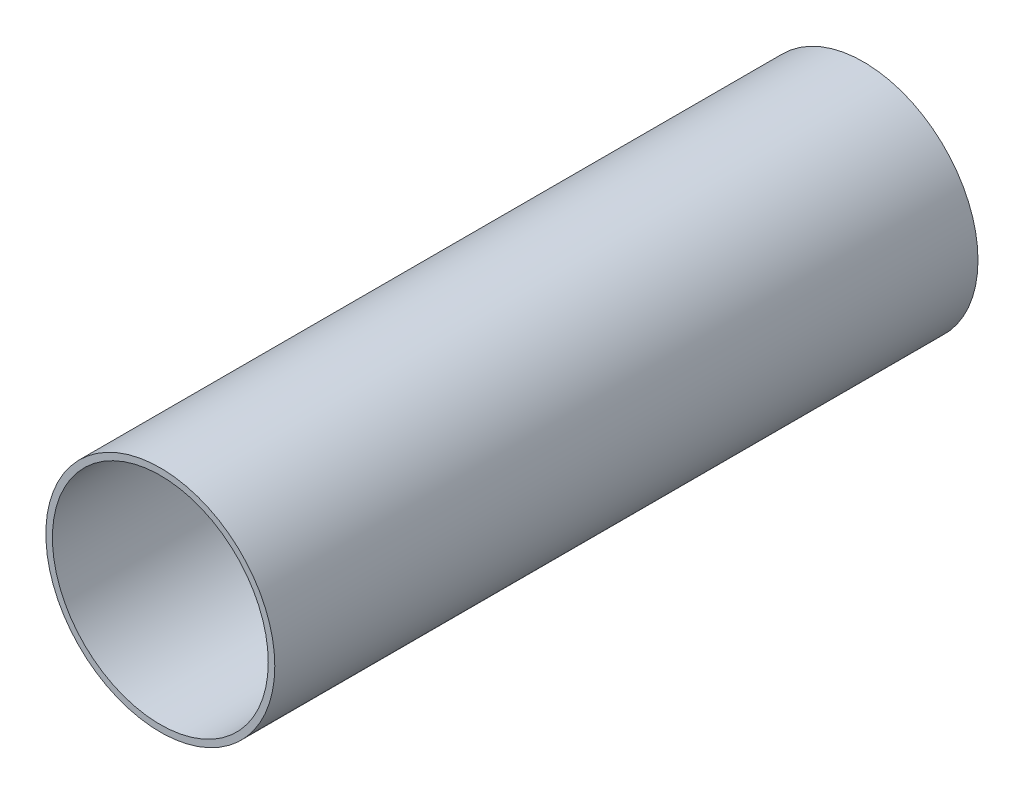
ISO-10303-21;
HEADER;
FILE_DESCRIPTION(('STEP AP214'),'2;1');
FILE_NAME('part.step','',(''),(''),'','','');
FILE_SCHEMA(('AUTOMOTIVE_DESIGN { 1 0 10303 214 1 1 1 1 }'));
ENDSEC;
DATA;
#1=APPLICATION_CONTEXT('core data for automotive mechanical design processes');
#2=APPLICATION_PROTOCOL_DEFINITION('international standard','automotive_design',2000,#1);
#3=PRODUCT_CONTEXT('',#1,'mechanical');
#4=PRODUCT('Part','Part','',(#3));
#5=PRODUCT_RELATED_PRODUCT_CATEGORY('part','',(#4));
#6=PRODUCT_DEFINITION_FORMATION('','',#4);
#7=PRODUCT_DEFINITION_CONTEXT('part definition',#1,'design');
#8=PRODUCT_DEFINITION('design','',#6,#7);
#9=PRODUCT_DEFINITION_SHAPE('','',#8);
#10=(LENGTH_UNIT() NAMED_UNIT(*) SI_UNIT(.MILLI.,.METRE.));
#11=(NAMED_UNIT(*) PLANE_ANGLE_UNIT() SI_UNIT($,.RADIAN.));
#12=(NAMED_UNIT(*) SI_UNIT($,.STERADIAN.) SOLID_ANGLE_UNIT());
#13=UNCERTAINTY_MEASURE_WITH_UNIT(LENGTH_MEASURE(1.E-05),#10,'distance_accuracy_value','');
#14=(GEOMETRIC_REPRESENTATION_CONTEXT(3) GLOBAL_UNCERTAINTY_ASSIGNED_CONTEXT((#13)) GLOBAL_UNIT_ASSIGNED_CONTEXT((#10,
#11,#12)) REPRESENTATION_CONTEXT('',''));
#15=CARTESIAN_POINT('',(0.,0.,0.));
#16=DIRECTION('',(0.,0.,1.));
#17=DIRECTION('',(1.,0.,0.));
#18=AXIS2_PLACEMENT_3D('',#15,#16,#17);
#19=CARTESIAN_POINT('',(0.,0.,215.));
#20=DIRECTION('',(0.,0.,1.));
#21=DIRECTION('',(1.,0.,0.));
#22=AXIS2_PLACEMENT_3D('',#19,#20,#21);
#23=PLANE('',#22);
#24=CARTESIAN_POINT('',(0.,0.,215.));
#25=DIRECTION('',(0.,0.,1.));
#26=DIRECTION('',(1.,0.,0.));
#27=AXIS2_PLACEMENT_3D('',#24,#25,#26);
#28=CIRCLE('',#27,35.);
#29=CARTESIAN_POINT('',(35.,0.,215.));
#30=VERTEX_POINT('',#29);
#31=EDGE_CURVE('E10',#30,#30,#28,.T.);
#32=ORIENTED_EDGE('',*,*,#31,.T.);
#33=EDGE_LOOP('',(#32));
#34=FACE_BOUND('',#33,.T.);
#35=CARTESIAN_POINT('',(0.,0.,215.));
#36=DIRECTION('',(0.,0.,1.));
#37=DIRECTION('',(1.,0.,0.));
#38=AXIS2_PLACEMENT_3D('',#35,#36,#37);
#39=CIRCLE('',#38,33.);
#40=CARTESIAN_POINT('',(33.,0.,215.));
#41=VERTEX_POINT('',#40);
#42=EDGE_CURVE('E43',#41,#41,#39,.T.);
#43=ORIENTED_EDGE('',*,*,#42,.F.);
#44=EDGE_LOOP('',(#43));
#45=FACE_BOUND('',#44,.T.);
#46=ADVANCED_FACE('F32',(#34,#45),#23,.T.);
#47=CARTESIAN_POINT('',(0.,0.,0.));
#48=DIRECTION('',(0.,0.,1.));
#49=DIRECTION('',(1.,0.,0.));
#50=AXIS2_PLACEMENT_3D('',#47,#48,#49);
#51=PLANE('',#50);
#52=CARTESIAN_POINT('',(0.,0.,0.));
#53=DIRECTION('',(0.,0.,1.));
#54=DIRECTION('',(1.,0.,0.));
#55=AXIS2_PLACEMENT_3D('',#52,#53,#54);
#56=CIRCLE('',#55,35.);
#57=CARTESIAN_POINT('',(35.,0.,0.));
#58=VERTEX_POINT('',#57);
#59=EDGE_CURVE('E36',#58,#58,#56,.T.);
#60=ORIENTED_EDGE('',*,*,#59,.F.);
#61=EDGE_LOOP('',(#60));
#62=FACE_BOUND('',#61,.T.);
#63=CARTESIAN_POINT('',(0.,0.,0.));
#64=DIRECTION('',(0.,0.,1.));
#65=DIRECTION('',(1.,0.,0.));
#66=AXIS2_PLACEMENT_3D('',#63,#64,#65);
#67=CIRCLE('',#66,33.);
#68=CARTESIAN_POINT('',(33.,0.,0.));
#69=VERTEX_POINT('',#68);
#70=EDGE_CURVE('E45',#69,#69,#67,.T.);
#71=ORIENTED_EDGE('',*,*,#70,.T.);
#72=EDGE_LOOP('',(#71));
#73=FACE_BOUND('',#72,.T.);
#74=ADVANCED_FACE('F55',(#62,#73),#51,.F.);
#75=CARTESIAN_POINT('',(0.,0.,215.));
#76=DIRECTION('',(0.,0.,-1.));
#77=DIRECTION('',(-1.,0.,0.));
#78=AXIS2_PLACEMENT_3D('',#75,#76,#77);
#79=CYLINDRICAL_SURFACE('',#78,35.);
#80=ORIENTED_EDGE('',*,*,#31,.F.);
#81=EDGE_LOOP('',(#80));
#82=FACE_BOUND('',#81,.T.);
#83=ORIENTED_EDGE('',*,*,#59,.T.);
#84=EDGE_LOOP('',(#83));
#85=FACE_BOUND('',#84,.T.);
#86=ADVANCED_FACE('F34',(#82,#85),#79,.T.);
#87=CARTESIAN_POINT('',(0.,0.,215.));
#88=DIRECTION('',(0.,0.,-1.));
#89=DIRECTION('',(-1.,0.,0.));
#90=AXIS2_PLACEMENT_3D('',#87,#88,#89);
#91=CYLINDRICAL_SURFACE('',#90,33.);
#92=ORIENTED_EDGE('',*,*,#42,.T.);
#93=EDGE_LOOP('',(#92));
#94=FACE_BOUND('',#93,.T.);
#95=ORIENTED_EDGE('',*,*,#70,.F.);
#96=EDGE_LOOP('',(#95));
#97=FACE_BOUND('',#96,.T.);
#98=ADVANCED_FACE('F51',(#94,#97),#91,.F.);
#99=CLOSED_SHELL('',(#46,#74,#86,#98));
#100=MANIFOLD_SOLID_BREP('B2',#99);
#101=ADVANCED_BREP_SHAPE_REPRESENTATION('',(#18,#100),#14);
#102=SHAPE_DEFINITION_REPRESENTATION(#9,#101);
ENDSEC;
END-ISO-10303-21;
